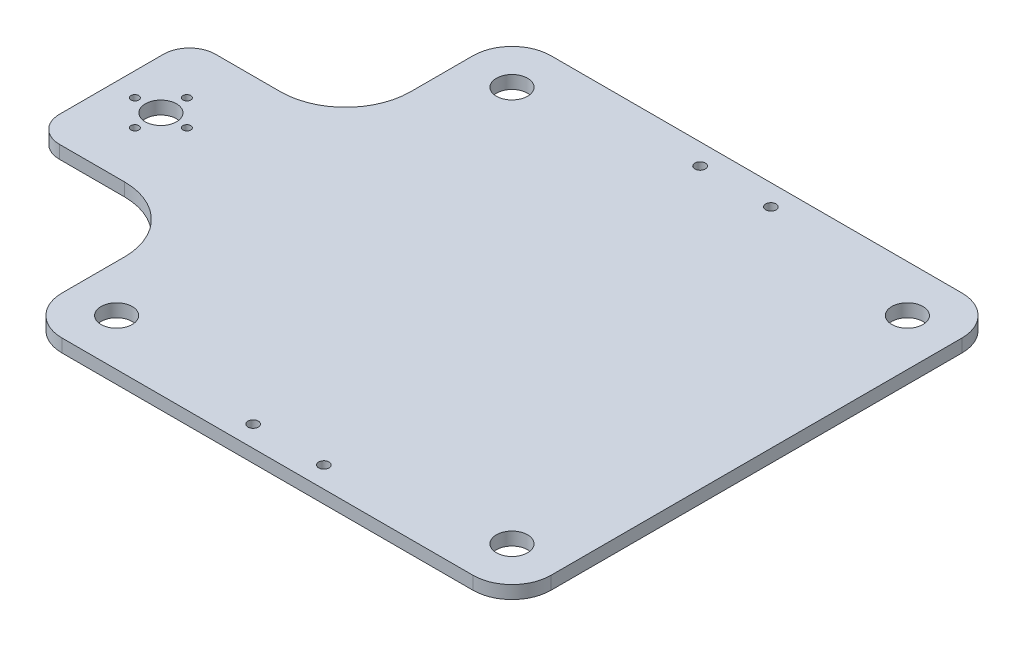
ISO-10303-21;
HEADER;
FILE_DESCRIPTION(('STEP AP214'),'2;1');
FILE_NAME('part.step','',(''),(''),'','','');
FILE_SCHEMA(('AUTOMOTIVE_DESIGN { 1 0 10303 214 1 1 1 1 }'));
ENDSEC;
DATA;
#1=APPLICATION_CONTEXT('core data for automotive mechanical design processes');
#2=APPLICATION_PROTOCOL_DEFINITION('international standard','automotive_design',2000,#1);
#3=PRODUCT_CONTEXT('',#1,'mechanical');
#4=PRODUCT('Part','Part','',(#3));
#5=PRODUCT_RELATED_PRODUCT_CATEGORY('part','',(#4));
#6=PRODUCT_DEFINITION_FORMATION('','',#4);
#7=PRODUCT_DEFINITION_CONTEXT('part definition',#1,'design');
#8=PRODUCT_DEFINITION('design','',#6,#7);
#9=PRODUCT_DEFINITION_SHAPE('','',#8);
#10=(LENGTH_UNIT() NAMED_UNIT(*) SI_UNIT(.MILLI.,.METRE.));
#11=(NAMED_UNIT(*) PLANE_ANGLE_UNIT() SI_UNIT($,.RADIAN.));
#12=(NAMED_UNIT(*) SI_UNIT($,.STERADIAN.) SOLID_ANGLE_UNIT());
#13=UNCERTAINTY_MEASURE_WITH_UNIT(LENGTH_MEASURE(1.E-05),#10,'distance_accuracy_value','');
#14=(GEOMETRIC_REPRESENTATION_CONTEXT(3) GLOBAL_UNCERTAINTY_ASSIGNED_CONTEXT((#13)) GLOBAL_UNIT_ASSIGNED_CONTEXT((#10,
#11,#12)) REPRESENTATION_CONTEXT('',''));
#15=CARTESIAN_POINT('',(0.,0.,0.));
#16=DIRECTION('',(0.,0.,1.));
#17=DIRECTION('',(1.,0.,0.));
#18=AXIS2_PLACEMENT_3D('',#15,#16,#17);
#19=CARTESIAN_POINT('',(-79.,2.5,79.));
#20=DIRECTION('',(0.,-1.,0.));
#21=DIRECTION('',(0.,0.,-1.));
#22=AXIS2_PLACEMENT_3D('',#19,#20,#21);
#23=PLANE('',#22);
#24=DIRECTION('',(0.,0.,1.));
#25=VECTOR('',#24,1.);
#26=CARTESIAN_POINT('',(-154.,2.5,30.));
#27=LINE('',#26,#25);
#28=CARTESIAN_POINT('',(-154.,2.5,-20.));
#29=VERTEX_POINT('',#28);
#30=CARTESIAN_POINT('',(-154.,2.5,20.));
#31=VERTEX_POINT('',#30);
#32=EDGE_CURVE('E212',#29,#31,#27,.T.);
#33=ORIENTED_EDGE('',*,*,#32,.T.);
#34=CARTESIAN_POINT('',(-144.,2.5,20.));
#35=DIRECTION('',(0.,-1.,0.));
#36=DIRECTION('',(0.,0.,-1.));
#37=AXIS2_PLACEMENT_3D('',#34,#35,#36);
#38=CIRCLE('',#37,10.);
#39=CARTESIAN_POINT('',(-144.,2.5,30.));
#40=VERTEX_POINT('',#39);
#41=EDGE_CURVE('E42',#31,#40,#38,.F.);
#42=ORIENTED_EDGE('',*,*,#41,.T.);
#43=DIRECTION('',(1.,0.,0.));
#44=VECTOR('',#43,1.);
#45=CARTESIAN_POINT('',(-94.,2.5,30.));
#46=LINE('',#45,#44);
#47=CARTESIAN_POINT('',(-119.,2.5,30.));
#48=VERTEX_POINT('',#47);
#49=EDGE_CURVE('E211',#40,#48,#46,.T.);
#50=ORIENTED_EDGE('',*,*,#49,.T.);
#51=CARTESIAN_POINT('',(-119.,2.5,55.));
#52=DIRECTION('',(0.,-1.,0.));
#53=DIRECTION('',(0.,0.,-1.));
#54=AXIS2_PLACEMENT_3D('',#51,#52,#53);
#55=CIRCLE('',#54,25.);
#56=CARTESIAN_POINT('',(-94.,2.5,55.));
#57=VERTEX_POINT('',#56);
#58=EDGE_CURVE('E154',#48,#57,#55,.T.);
#59=ORIENTED_EDGE('',*,*,#58,.T.);
#60=DIRECTION('',(0.,0.,1.));
#61=VECTOR('',#60,1.);
#62=CARTESIAN_POINT('',(-94.,2.5,30.));
#63=LINE('',#62,#61);
#64=CARTESIAN_POINT('',(-94.,2.5,79.));
#65=VERTEX_POINT('',#64);
#66=EDGE_CURVE('E148',#57,#65,#63,.T.);
#67=ORIENTED_EDGE('',*,*,#66,.T.);
#68=CARTESIAN_POINT('',(-79.,2.5,79.));
#69=DIRECTION('',(0.,1.,0.));
#70=DIRECTION('',(0.,0.,-1.));
#71=AXIS2_PLACEMENT_3D('',#68,#69,#70);
#72=CIRCLE('',#71,15.);
#73=CARTESIAN_POINT('',(-79.,2.5,94.));
#74=VERTEX_POINT('',#73);
#75=EDGE_CURVE('E151',#65,#74,#72,.T.);
#76=ORIENTED_EDGE('',*,*,#75,.T.);
#77=DIRECTION('',(1.,0.,0.));
#78=VECTOR('',#77,1.);
#79=CARTESIAN_POINT('',(-79.,2.5,94.));
#80=LINE('',#79,#78);
#81=CARTESIAN_POINT('',(79.,2.5,94.));
#82=VERTEX_POINT('',#81);
#83=EDGE_CURVE('E168',#74,#82,#80,.T.);
#84=ORIENTED_EDGE('',*,*,#83,.T.);
#85=CARTESIAN_POINT('',(79.,2.5,79.));
#86=DIRECTION('',(0.,1.,0.));
#87=DIRECTION('',(0.,0.,-1.));
#88=AXIS2_PLACEMENT_3D('',#85,#86,#87);
#89=CIRCLE('',#88,15.);
#90=CARTESIAN_POINT('',(94.,2.5,79.));
#91=VERTEX_POINT('',#90);
#92=EDGE_CURVE('E257',#82,#91,#89,.T.);
#93=ORIENTED_EDGE('',*,*,#92,.T.);
#94=DIRECTION('',(0.,0.,-1.));
#95=VECTOR('',#94,1.);
#96=CARTESIAN_POINT('',(94.,2.5,-79.));
#97=LINE('',#96,#95);
#98=CARTESIAN_POINT('',(94.,2.5,-79.));
#99=VERTEX_POINT('',#98);
#100=EDGE_CURVE('E302',#91,#99,#97,.T.);
#101=ORIENTED_EDGE('',*,*,#100,.T.);
#102=CARTESIAN_POINT('',(79.,2.5,-79.));
#103=DIRECTION('',(0.,1.,0.));
#104=DIRECTION('',(0.,0.,1.));
#105=AXIS2_PLACEMENT_3D('',#102,#103,#104);
#106=CIRCLE('',#105,15.);
#107=CARTESIAN_POINT('',(79.,2.5,-94.));
#108=VERTEX_POINT('',#107);
#109=EDGE_CURVE('E306',#99,#108,#106,.T.);
#110=ORIENTED_EDGE('',*,*,#109,.T.);
#111=DIRECTION('',(-1.,0.,0.));
#112=VECTOR('',#111,1.);
#113=CARTESIAN_POINT('',(-79.,2.5,-94.));
#114=LINE('',#113,#112);
#115=CARTESIAN_POINT('',(-79.,2.5,-94.));
#116=VERTEX_POINT('',#115);
#117=EDGE_CURVE('E308',#108,#116,#114,.T.);
#118=ORIENTED_EDGE('',*,*,#117,.T.);
#119=CARTESIAN_POINT('',(-79.,2.5,-79.));
#120=DIRECTION('',(0.,1.,0.));
#121=DIRECTION('',(0.,0.,-1.));
#122=AXIS2_PLACEMENT_3D('',#119,#120,#121);
#123=CIRCLE('',#122,15.);
#124=CARTESIAN_POINT('',(-94.,2.5,-79.));
#125=VERTEX_POINT('',#124);
#126=EDGE_CURVE('E295',#116,#125,#123,.T.);
#127=ORIENTED_EDGE('',*,*,#126,.T.);
#128=DIRECTION('',(0.,0.,1.));
#129=VECTOR('',#128,1.);
#130=CARTESIAN_POINT('',(-94.,2.5,-79.));
#131=LINE('',#130,#129);
#132=CARTESIAN_POINT('',(-94.,2.5,-55.));
#133=VERTEX_POINT('',#132);
#134=EDGE_CURVE('E290',#125,#133,#131,.T.);
#135=ORIENTED_EDGE('',*,*,#134,.T.);
#136=CARTESIAN_POINT('',(-119.,2.5,-55.));
#137=DIRECTION('',(0.,-1.,0.));
#138=DIRECTION('',(0.,0.,-1.));
#139=AXIS2_PLACEMENT_3D('',#136,#137,#138);
#140=CIRCLE('',#139,25.);
#141=CARTESIAN_POINT('',(-119.,2.5,-30.));
#142=VERTEX_POINT('',#141);
#143=EDGE_CURVE('E195',#133,#142,#140,.T.);
#144=ORIENTED_EDGE('',*,*,#143,.T.);
#145=DIRECTION('',(-1.,0.,0.));
#146=VECTOR('',#145,1.);
#147=CARTESIAN_POINT('',(-154.,2.5,-30.));
#148=LINE('',#147,#146);
#149=CARTESIAN_POINT('',(-144.,2.5,-30.));
#150=VERTEX_POINT('',#149);
#151=EDGE_CURVE('E288',#142,#150,#148,.T.);
#152=ORIENTED_EDGE('',*,*,#151,.T.);
#153=CARTESIAN_POINT('',(-144.,2.5,-20.));
#154=DIRECTION('',(0.,-1.,0.));
#155=DIRECTION('',(0.,0.,-1.));
#156=AXIS2_PLACEMENT_3D('',#153,#154,#155);
#157=CIRCLE('',#156,10.);
#158=EDGE_CURVE('E208',#150,#29,#157,.F.);
#159=ORIENTED_EDGE('',*,*,#158,.T.);
#160=EDGE_LOOP('',(#33,#42,#50,#59,#67,#76,#84,#93,#101,#110,#118,#127,#135,#144,#152,#159));
#161=FACE_BOUND('',#160,.T.);
#162=CARTESIAN_POINT('',(-76.0139789775538,2.5,-76.0139789775538));
#163=DIRECTION('',(0.,1.,0.));
#164=DIRECTION('',(0.,0.,1.));
#165=AXIS2_PLACEMENT_3D('',#162,#163,#164);
#166=CIRCLE('',#165,6.);
#167=CARTESIAN_POINT('',(-76.0139789775538,2.5,-70.0139789775538));
#168=VERTEX_POINT('',#167);
#169=EDGE_CURVE('E299',#168,#168,#166,.T.);
#170=ORIENTED_EDGE('',*,*,#169,.F.);
#171=EDGE_LOOP('',(#170));
#172=FACE_BOUND('',#171,.T.);
#173=CARTESIAN_POINT('',(76.0139789775538,2.5,-76.0139789775538));
#174=DIRECTION('',(0.,1.,0.));
#175=DIRECTION('',(0.,0.,1.));
#176=AXIS2_PLACEMENT_3D('',#173,#174,#175);
#177=CIRCLE('',#176,5.99999999999999);
#178=CARTESIAN_POINT('',(76.0139789775538,2.5,-70.0139789775538));
#179=VERTEX_POINT('',#178);
#180=EDGE_CURVE('E673',#179,#179,#177,.T.);
#181=ORIENTED_EDGE('',*,*,#180,.F.);
#182=EDGE_LOOP('',(#181));
#183=FACE_BOUND('',#182,.T.);
#184=CARTESIAN_POINT('',(76.0139789775538,2.5,76.0139789775538));
#185=DIRECTION('',(0.,1.,0.));
#186=DIRECTION('',(0.,0.,1.));
#187=AXIS2_PLACEMENT_3D('',#184,#185,#186);
#188=CIRCLE('',#187,5.99999999999999);
#189=CARTESIAN_POINT('',(76.0139789775538,2.5,82.0139789775538));
#190=VERTEX_POINT('',#189);
#191=EDGE_CURVE('E667',#190,#190,#188,.T.);
#192=ORIENTED_EDGE('',*,*,#191,.F.);
#193=EDGE_LOOP('',(#192));
#194=FACE_BOUND('',#193,.T.);
#195=CARTESIAN_POINT('',(-76.0139789775538,2.5,76.0139789775538));
#196=DIRECTION('',(0.,1.,0.));
#197=DIRECTION('',(0.,0.,1.));
#198=AXIS2_PLACEMENT_3D('',#195,#196,#197);
#199=CIRCLE('',#198,5.99999999999999);
#200=CARTESIAN_POINT('',(-76.0139789775538,2.5,82.0139789775538));
#201=VERTEX_POINT('',#200);
#202=EDGE_CURVE('E661',#201,#201,#199,.T.);
#203=ORIENTED_EDGE('',*,*,#202,.F.);
#204=EDGE_LOOP('',(#203));
#205=FACE_BOUND('',#204,.T.);
#206=CARTESIAN_POINT('',(13.6097984585001,2.5,-85.928885631777));
#207=DIRECTION('',(0.,1.,0.));
#208=DIRECTION('',(0.,0.,1.));
#209=AXIS2_PLACEMENT_3D('',#206,#207,#208);
#210=CIRCLE('',#209,2.);
#211=CARTESIAN_POINT('',(13.6097984585001,2.5,-83.928885631777));
#212=VERTEX_POINT('',#211);
#213=EDGE_CURVE('E655',#212,#212,#210,.T.);
#214=ORIENTED_EDGE('',*,*,#213,.F.);
#215=EDGE_LOOP('',(#214));
#216=FACE_BOUND('',#215,.T.);
#217=CARTESIAN_POINT('',(13.6097984584996,2.5,85.9288856317771));
#218=DIRECTION('',(0.,1.,0.));
#219=DIRECTION('',(0.,0.,1.));
#220=AXIS2_PLACEMENT_3D('',#217,#218,#219);
#221=CIRCLE('',#220,2.);
#222=CARTESIAN_POINT('',(13.6097984584996,2.5,87.9288856317771));
#223=VERTEX_POINT('',#222);
#224=EDGE_CURVE('E649',#223,#223,#221,.T.);
#225=ORIENTED_EDGE('',*,*,#224,.F.);
#226=EDGE_LOOP('',(#225));
#227=FACE_BOUND('',#226,.T.);
#228=CARTESIAN_POINT('',(-13.6097984584995,2.5,-85.9288856317771));
#229=DIRECTION('',(0.,1.,0.));
#230=DIRECTION('',(0.,0.,1.));
#231=AXIS2_PLACEMENT_3D('',#228,#229,#230);
#232=CIRCLE('',#231,2.);
#233=CARTESIAN_POINT('',(-13.6097984584995,2.5,-83.9288856317771));
#234=VERTEX_POINT('',#233);
#235=EDGE_CURVE('E643',#234,#234,#232,.T.);
#236=ORIENTED_EDGE('',*,*,#235,.F.);
#237=EDGE_LOOP('',(#236));
#238=FACE_BOUND('',#237,.T.);
#239=CARTESIAN_POINT('',(-135.,2.5,10.));
#240=DIRECTION('',(0.,1.,0.));
#241=DIRECTION('',(0.,0.,1.));
#242=AXIS2_PLACEMENT_3D('',#239,#240,#241);
#243=CIRCLE('',#242,1.5);
#244=CARTESIAN_POINT('',(-135.,2.5,11.5));
#245=VERTEX_POINT('',#244);
#246=EDGE_CURVE('E637',#245,#245,#243,.T.);
#247=ORIENTED_EDGE('',*,*,#246,.F.);
#248=EDGE_LOOP('',(#247));
#249=FACE_BOUND('',#248,.T.);
#250=CARTESIAN_POINT('',(-135.,2.5,0.));
#251=DIRECTION('',(0.,1.,0.));
#252=DIRECTION('',(0.,0.,1.));
#253=AXIS2_PLACEMENT_3D('',#250,#251,#252);
#254=CIRCLE('',#253,6.00000000000002);
#255=CARTESIAN_POINT('',(-135.,2.5,6.00000000000002));
#256=VERTEX_POINT('',#255);
#257=EDGE_CURVE('E631',#256,#256,#254,.T.);
#258=ORIENTED_EDGE('',*,*,#257,.F.);
#259=EDGE_LOOP('',(#258));
#260=FACE_BOUND('',#259,.T.);
#261=CARTESIAN_POINT('',(-145.,2.5,0.));
#262=DIRECTION('',(0.,1.,0.));
#263=DIRECTION('',(0.,0.,1.));
#264=AXIS2_PLACEMENT_3D('',#261,#262,#263);
#265=CIRCLE('',#264,1.5);
#266=CARTESIAN_POINT('',(-145.,2.5,1.49999999999999));
#267=VERTEX_POINT('',#266);
#268=EDGE_CURVE('E625',#267,#267,#265,.T.);
#269=ORIENTED_EDGE('',*,*,#268,.F.);
#270=EDGE_LOOP('',(#269));
#271=FACE_BOUND('',#270,.T.);
#272=CARTESIAN_POINT('',(-13.6097984585001,2.5,85.928885631777));
#273=DIRECTION('',(0.,1.,0.));
#274=DIRECTION('',(0.,0.,1.));
#275=AXIS2_PLACEMENT_3D('',#272,#273,#274);
#276=CIRCLE('',#275,2.);
#277=CARTESIAN_POINT('',(-13.6097984585001,2.5,87.928885631777));
#278=VERTEX_POINT('',#277);
#279=EDGE_CURVE('E619',#278,#278,#276,.T.);
#280=ORIENTED_EDGE('',*,*,#279,.F.);
#281=EDGE_LOOP('',(#280));
#282=FACE_BOUND('',#281,.T.);
#283=CARTESIAN_POINT('',(-135.,2.5,-10.));
#284=DIRECTION('',(0.,1.,0.));
#285=DIRECTION('',(0.,0.,1.));
#286=AXIS2_PLACEMENT_3D('',#283,#284,#285);
#287=CIRCLE('',#286,1.5);
#288=CARTESIAN_POINT('',(-135.,2.5,-8.50000000000001));
#289=VERTEX_POINT('',#288);
#290=EDGE_CURVE('E613',#289,#289,#287,.T.);
#291=ORIENTED_EDGE('',*,*,#290,.F.);
#292=EDGE_LOOP('',(#291));
#293=FACE_BOUND('',#292,.T.);
#294=CARTESIAN_POINT('',(-125.,2.5,0.));
#295=DIRECTION('',(0.,1.,0.));
#296=DIRECTION('',(0.,0.,1.));
#297=AXIS2_PLACEMENT_3D('',#294,#295,#296);
#298=CIRCLE('',#297,1.5);
#299=CARTESIAN_POINT('',(-125.,2.5,1.5));
#300=VERTEX_POINT('',#299);
#301=EDGE_CURVE('E604',#300,#300,#298,.T.);
#302=ORIENTED_EDGE('',*,*,#301,.F.);
#303=EDGE_LOOP('',(#302));
#304=FACE_BOUND('',#303,.T.);
#305=ADVANCED_FACE('F34',(#161,#172,#183,#194,#205,#216,#227,#238,#249,#260,#271,#282,#293,
#304),#23,.F.);
#306=CARTESIAN_POINT('',(-79.,-2.5,79.));
#307=DIRECTION('',(0.,-1.,0.));
#308=DIRECTION('',(0.,0.,-1.));
#309=AXIS2_PLACEMENT_3D('',#306,#307,#308);
#310=PLANE('',#309);
#311=CARTESIAN_POINT('',(-135.,-2.5,-10.));
#312=DIRECTION('',(0.,1.,0.));
#313=DIRECTION('',(0.,0.,1.));
#314=AXIS2_PLACEMENT_3D('',#311,#312,#313);
#315=CIRCLE('',#314,1.5);
#316=CARTESIAN_POINT('',(-135.,-2.5,-8.50000000000001));
#317=VERTEX_POINT('',#316);
#318=EDGE_CURVE('E610',#317,#317,#315,.T.);
#319=ORIENTED_EDGE('',*,*,#318,.T.);
#320=EDGE_LOOP('',(#319));
#321=FACE_BOUND('',#320,.T.);
#322=CARTESIAN_POINT('',(-145.,-2.5,0.));
#323=DIRECTION('',(0.,1.,0.));
#324=DIRECTION('',(0.,0.,1.));
#325=AXIS2_PLACEMENT_3D('',#322,#323,#324);
#326=CIRCLE('',#325,1.5);
#327=CARTESIAN_POINT('',(-145.,-2.5,1.49999999999999));
#328=VERTEX_POINT('',#327);
#329=EDGE_CURVE('E622',#328,#328,#326,.T.);
#330=ORIENTED_EDGE('',*,*,#329,.T.);
#331=EDGE_LOOP('',(#330));
#332=FACE_BOUND('',#331,.T.);
#333=CARTESIAN_POINT('',(-135.,-2.5,10.));
#334=DIRECTION('',(0.,1.,0.));
#335=DIRECTION('',(0.,0.,1.));
#336=AXIS2_PLACEMENT_3D('',#333,#334,#335);
#337=CIRCLE('',#336,1.5);
#338=CARTESIAN_POINT('',(-135.,-2.5,11.5));
#339=VERTEX_POINT('',#338);
#340=EDGE_CURVE('E634',#339,#339,#337,.T.);
#341=ORIENTED_EDGE('',*,*,#340,.T.);
#342=EDGE_LOOP('',(#341));
#343=FACE_BOUND('',#342,.T.);
#344=CARTESIAN_POINT('',(13.6097984584996,-2.5,85.9288856317771));
#345=DIRECTION('',(0.,1.,0.));
#346=DIRECTION('',(0.,0.,1.));
#347=AXIS2_PLACEMENT_3D('',#344,#345,#346);
#348=CIRCLE('',#347,2.);
#349=CARTESIAN_POINT('',(13.6097984584996,-2.5,87.9288856317771));
#350=VERTEX_POINT('',#349);
#351=EDGE_CURVE('E646',#350,#350,#348,.T.);
#352=ORIENTED_EDGE('',*,*,#351,.T.);
#353=EDGE_LOOP('',(#352));
#354=FACE_BOUND('',#353,.T.);
#355=CARTESIAN_POINT('',(-76.0139789775538,-2.5,76.0139789775538));
#356=DIRECTION('',(0.,1.,0.));
#357=DIRECTION('',(0.,0.,1.));
#358=AXIS2_PLACEMENT_3D('',#355,#356,#357);
#359=CIRCLE('',#358,5.99999999999999);
#360=CARTESIAN_POINT('',(-76.0139789775538,-2.5,82.0139789775538));
#361=VERTEX_POINT('',#360);
#362=EDGE_CURVE('E658',#361,#361,#359,.T.);
#363=ORIENTED_EDGE('',*,*,#362,.T.);
#364=EDGE_LOOP('',(#363));
#365=FACE_BOUND('',#364,.T.);
#366=CARTESIAN_POINT('',(76.0139789775538,-2.5,-76.0139789775538));
#367=DIRECTION('',(0.,1.,0.));
#368=DIRECTION('',(0.,0.,1.));
#369=AXIS2_PLACEMENT_3D('',#366,#367,#368);
#370=CIRCLE('',#369,5.99999999999999);
#371=CARTESIAN_POINT('',(76.0139789775538,-2.5,-70.0139789775538));
#372=VERTEX_POINT('',#371);
#373=EDGE_CURVE('E670',#372,#372,#370,.T.);
#374=ORIENTED_EDGE('',*,*,#373,.T.);
#375=EDGE_LOOP('',(#374));
#376=FACE_BOUND('',#375,.T.);
#377=DIRECTION('',(1.,0.,0.));
#378=VECTOR('',#377,1.);
#379=CARTESIAN_POINT('',(-94.,-2.5,30.));
#380=LINE('',#379,#378);
#381=CARTESIAN_POINT('',(-144.,-2.5,30.));
#382=VERTEX_POINT('',#381);
#383=CARTESIAN_POINT('',(-119.,-2.5,30.));
#384=VERTEX_POINT('',#383);
#385=EDGE_CURVE('E159',#382,#384,#380,.T.);
#386=ORIENTED_EDGE('',*,*,#385,.F.);
#387=CARTESIAN_POINT('',(-144.,-2.5,20.));
#388=DIRECTION('',(0.,-1.,0.));
#389=DIRECTION('',(0.,0.,-1.));
#390=AXIS2_PLACEMENT_3D('',#387,#388,#389);
#391=CIRCLE('',#390,10.);
#392=CARTESIAN_POINT('',(-154.,-2.5,20.));
#393=VERTEX_POINT('',#392);
#394=EDGE_CURVE('E202',#382,#393,#391,.T.);
#395=ORIENTED_EDGE('',*,*,#394,.T.);
#396=DIRECTION('',(0.,0.,1.));
#397=VECTOR('',#396,1.);
#398=CARTESIAN_POINT('',(-154.,-2.5,30.));
#399=LINE('',#398,#397);
#400=CARTESIAN_POINT('',(-154.,-2.5,-20.));
#401=VERTEX_POINT('',#400);
#402=EDGE_CURVE('E226',#401,#393,#399,.T.);
#403=ORIENTED_EDGE('',*,*,#402,.F.);
#404=CARTESIAN_POINT('',(-144.,-2.5,-20.));
#405=DIRECTION('',(0.,-1.,0.));
#406=DIRECTION('',(0.,0.,-1.));
#407=AXIS2_PLACEMENT_3D('',#404,#405,#406);
#408=CIRCLE('',#407,10.);
#409=CARTESIAN_POINT('',(-144.,-2.5,-30.));
#410=VERTEX_POINT('',#409);
#411=EDGE_CURVE('E200',#401,#410,#408,.T.);
#412=ORIENTED_EDGE('',*,*,#411,.T.);
#413=DIRECTION('',(-1.,0.,0.));
#414=VECTOR('',#413,1.);
#415=CARTESIAN_POINT('',(-154.,-2.5,-30.));
#416=LINE('',#415,#414);
#417=CARTESIAN_POINT('',(-119.,-2.5,-30.));
#418=VERTEX_POINT('',#417);
#419=EDGE_CURVE('E229',#418,#410,#416,.T.);
#420=ORIENTED_EDGE('',*,*,#419,.F.);
#421=CARTESIAN_POINT('',(-119.,-2.5,-55.));
#422=DIRECTION('',(0.,-1.,0.));
#423=DIRECTION('',(0.,0.,-1.));
#424=AXIS2_PLACEMENT_3D('',#421,#422,#423);
#425=CIRCLE('',#424,25.);
#426=CARTESIAN_POINT('',(-94.,-2.5,-55.));
#427=VERTEX_POINT('',#426);
#428=EDGE_CURVE('E193',#418,#427,#425,.F.);
#429=ORIENTED_EDGE('',*,*,#428,.T.);
#430=DIRECTION('',(0.,0.,1.));
#431=VECTOR('',#430,1.);
#432=CARTESIAN_POINT('',(-94.,-2.5,-79.));
#433=LINE('',#432,#431);
#434=CARTESIAN_POINT('',(-94.,-2.5,-79.));
#435=VERTEX_POINT('',#434);
#436=EDGE_CURVE('E232',#435,#427,#433,.T.);
#437=ORIENTED_EDGE('',*,*,#436,.F.);
#438=CARTESIAN_POINT('',(-79.,-2.5,-79.));
#439=DIRECTION('',(0.,1.,0.));
#440=DIRECTION('',(0.,0.,-1.));
#441=AXIS2_PLACEMENT_3D('',#438,#439,#440);
#442=CIRCLE('',#441,15.);
#443=CARTESIAN_POINT('',(-79.,-2.5,-94.));
#444=VERTEX_POINT('',#443);
#445=EDGE_CURVE('E274',#444,#435,#442,.T.);
#446=ORIENTED_EDGE('',*,*,#445,.F.);
#447=DIRECTION('',(-1.,0.,0.));
#448=VECTOR('',#447,1.);
#449=CARTESIAN_POINT('',(-79.,-2.5,-94.));
#450=LINE('',#449,#448);
#451=CARTESIAN_POINT('',(79.,-2.5,-94.));
#452=VERTEX_POINT('',#451);
#453=EDGE_CURVE('E272',#452,#444,#450,.T.);
#454=ORIENTED_EDGE('',*,*,#453,.F.);
#455=CARTESIAN_POINT('',(79.,-2.5,-79.));
#456=DIRECTION('',(0.,1.,0.));
#457=DIRECTION('',(0.,0.,1.));
#458=AXIS2_PLACEMENT_3D('',#455,#456,#457);
#459=CIRCLE('',#458,15.);
#460=CARTESIAN_POINT('',(94.,-2.5,-79.));
#461=VERTEX_POINT('',#460);
#462=EDGE_CURVE('E265',#461,#452,#459,.T.);
#463=ORIENTED_EDGE('',*,*,#462,.F.);
#464=DIRECTION('',(0.,0.,-1.));
#465=VECTOR('',#464,1.);
#466=CARTESIAN_POINT('',(94.,-2.5,-79.));
#467=LINE('',#466,#465);
#468=CARTESIAN_POINT('',(94.,-2.5,79.));
#469=VERTEX_POINT('',#468);
#470=EDGE_CURVE('E263',#469,#461,#467,.T.);
#471=ORIENTED_EDGE('',*,*,#470,.F.);
#472=CARTESIAN_POINT('',(79.,-2.5,79.));
#473=DIRECTION('',(0.,1.,0.));
#474=DIRECTION('',(0.,0.,-1.));
#475=AXIS2_PLACEMENT_3D('',#472,#473,#474);
#476=CIRCLE('',#475,15.);
#477=CARTESIAN_POINT('',(79.,-2.5,94.));
#478=VERTEX_POINT('',#477);
#479=EDGE_CURVE('E256',#478,#469,#476,.T.);
#480=ORIENTED_EDGE('',*,*,#479,.F.);
#481=DIRECTION('',(1.,0.,0.));
#482=VECTOR('',#481,1.);
#483=CARTESIAN_POINT('',(-79.,-2.5,94.));
#484=LINE('',#483,#482);
#485=CARTESIAN_POINT('',(-79.,-2.5,94.));
#486=VERTEX_POINT('',#485);
#487=EDGE_CURVE('E261',#486,#478,#484,.T.);
#488=ORIENTED_EDGE('',*,*,#487,.F.);
#489=CARTESIAN_POINT('',(-79.,-2.5,79.));
#490=DIRECTION('',(0.,1.,0.));
#491=DIRECTION('',(0.,0.,-1.));
#492=AXIS2_PLACEMENT_3D('',#489,#490,#491);
#493=CIRCLE('',#492,15.);
#494=CARTESIAN_POINT('',(-94.,-2.5,79.));
#495=VERTEX_POINT('',#494);
#496=EDGE_CURVE('E267',#495,#486,#493,.T.);
#497=ORIENTED_EDGE('',*,*,#496,.F.);
#498=DIRECTION('',(0.,0.,1.));
#499=VECTOR('',#498,1.);
#500=CARTESIAN_POINT('',(-94.,-2.5,30.));
#501=LINE('',#500,#499);
#502=CARTESIAN_POINT('',(-94.,-2.5,55.));
#503=VERTEX_POINT('',#502);
#504=EDGE_CURVE('E172',#503,#495,#501,.T.);
#505=ORIENTED_EDGE('',*,*,#504,.F.);
#506=CARTESIAN_POINT('',(-119.,-2.5,55.));
#507=DIRECTION('',(0.,-1.,0.));
#508=DIRECTION('',(0.,0.,-1.));
#509=AXIS2_PLACEMENT_3D('',#506,#507,#508);
#510=CIRCLE('',#509,25.);
#511=EDGE_CURVE('E189',#503,#384,#510,.F.);
#512=ORIENTED_EDGE('',*,*,#511,.T.);
#513=EDGE_LOOP('',(#386,#395,#403,#412,#420,#429,#437,#446,#454,#463,#471,#480,#488,#497,#505,#512));
#514=FACE_BOUND('',#513,.T.);
#515=CARTESIAN_POINT('',(-76.0139789775538,-2.5,-76.0139789775538));
#516=DIRECTION('',(0.,1.,0.));
#517=DIRECTION('',(0.,0.,1.));
#518=AXIS2_PLACEMENT_3D('',#515,#516,#517);
#519=CIRCLE('',#518,6.);
#520=CARTESIAN_POINT('',(-76.0139789775538,-2.5,-70.0139789775538));
#521=VERTEX_POINT('',#520);
#522=EDGE_CURVE('E676',#521,#521,#519,.T.);
#523=ORIENTED_EDGE('',*,*,#522,.T.);
#524=EDGE_LOOP('',(#523));
#525=FACE_BOUND('',#524,.T.);
#526=CARTESIAN_POINT('',(76.0139789775538,-2.5,76.0139789775538));
#527=DIRECTION('',(0.,1.,0.));
#528=DIRECTION('',(0.,0.,1.));
#529=AXIS2_PLACEMENT_3D('',#526,#527,#528);
#530=CIRCLE('',#529,5.99999999999999);
#531=CARTESIAN_POINT('',(76.0139789775538,-2.5,82.0139789775538));
#532=VERTEX_POINT('',#531);
#533=EDGE_CURVE('E664',#532,#532,#530,.T.);
#534=ORIENTED_EDGE('',*,*,#533,.T.);
#535=EDGE_LOOP('',(#534));
#536=FACE_BOUND('',#535,.T.);
#537=CARTESIAN_POINT('',(13.6097984585001,-2.5,-85.928885631777));
#538=DIRECTION('',(0.,1.,0.));
#539=DIRECTION('',(0.,0.,1.));
#540=AXIS2_PLACEMENT_3D('',#537,#538,#539);
#541=CIRCLE('',#540,2.);
#542=CARTESIAN_POINT('',(13.6097984585001,-2.5,-83.928885631777));
#543=VERTEX_POINT('',#542);
#544=EDGE_CURVE('E652',#543,#543,#541,.T.);
#545=ORIENTED_EDGE('',*,*,#544,.T.);
#546=EDGE_LOOP('',(#545));
#547=FACE_BOUND('',#546,.T.);
#548=CARTESIAN_POINT('',(-13.6097984584995,-2.5,-85.9288856317771));
#549=DIRECTION('',(0.,1.,0.));
#550=DIRECTION('',(0.,0.,1.));
#551=AXIS2_PLACEMENT_3D('',#548,#549,#550);
#552=CIRCLE('',#551,2.);
#553=CARTESIAN_POINT('',(-13.6097984584995,-2.5,-83.9288856317771));
#554=VERTEX_POINT('',#553);
#555=EDGE_CURVE('E640',#554,#554,#552,.T.);
#556=ORIENTED_EDGE('',*,*,#555,.T.);
#557=EDGE_LOOP('',(#556));
#558=FACE_BOUND('',#557,.T.);
#559=CARTESIAN_POINT('',(-135.,-2.5,0.));
#560=DIRECTION('',(0.,1.,0.));
#561=DIRECTION('',(0.,0.,1.));
#562=AXIS2_PLACEMENT_3D('',#559,#560,#561);
#563=CIRCLE('',#562,6.00000000000002);
#564=CARTESIAN_POINT('',(-135.,-2.5,6.00000000000002));
#565=VERTEX_POINT('',#564);
#566=EDGE_CURVE('E628',#565,#565,#563,.T.);
#567=ORIENTED_EDGE('',*,*,#566,.T.);
#568=EDGE_LOOP('',(#567));
#569=FACE_BOUND('',#568,.T.);
#570=CARTESIAN_POINT('',(-13.6097984585001,-2.5,85.928885631777));
#571=DIRECTION('',(0.,1.,0.));
#572=DIRECTION('',(0.,0.,1.));
#573=AXIS2_PLACEMENT_3D('',#570,#571,#572);
#574=CIRCLE('',#573,2.);
#575=CARTESIAN_POINT('',(-13.6097984585001,-2.5,87.928885631777));
#576=VERTEX_POINT('',#575);
#577=EDGE_CURVE('E616',#576,#576,#574,.T.);
#578=ORIENTED_EDGE('',*,*,#577,.T.);
#579=EDGE_LOOP('',(#578));
#580=FACE_BOUND('',#579,.T.);
#581=CARTESIAN_POINT('',(-125.,-2.5,0.));
#582=DIRECTION('',(0.,1.,0.));
#583=DIRECTION('',(0.,0.,1.));
#584=AXIS2_PLACEMENT_3D('',#581,#582,#583);
#585=CIRCLE('',#584,1.5);
#586=CARTESIAN_POINT('',(-125.,-2.5,1.5));
#587=VERTEX_POINT('',#586);
#588=EDGE_CURVE('E607',#587,#587,#585,.T.);
#589=ORIENTED_EDGE('',*,*,#588,.T.);
#590=EDGE_LOOP('',(#589));
#591=FACE_BOUND('',#590,.T.);
#592=ADVANCED_FACE('F224',(#321,#332,#343,#354,#365,#376,#514,#525,#536,#547,#558,#569,#580,
#591),#310,.T.);
#593=CARTESIAN_POINT('',(-94.,2.5,30.));
#594=DIRECTION('',(1.,0.,0.));
#595=DIRECTION('',(0.,0.,-1.));
#596=AXIS2_PLACEMENT_3D('',#593,#594,#595);
#597=PLANE('',#596);
#598=ORIENTED_EDGE('',*,*,#66,.F.);
#599=DIRECTION('',(0.,-1.,0.));
#600=VECTOR('',#599,1.);
#601=CARTESIAN_POINT('',(-94.,-2.5,55.));
#602=LINE('',#601,#600);
#603=EDGE_CURVE('E174',#57,#503,#602,.T.);
#604=ORIENTED_EDGE('',*,*,#603,.T.);
#605=ORIENTED_EDGE('',*,*,#504,.T.);
#606=DIRECTION('',(0.,-1.,0.));
#607=VECTOR('',#606,1.);
#608=CARTESIAN_POINT('',(-94.,2.5,79.));
#609=LINE('',#608,#607);
#610=EDGE_CURVE('E164',#65,#495,#609,.T.);
#611=ORIENTED_EDGE('',*,*,#610,.F.);
#612=EDGE_LOOP('',(#598,#604,#605,#611));
#613=FACE_BOUND('',#612,.T.);
#614=ADVANCED_FACE('F170',(#613),#597,.F.);
#615=CARTESIAN_POINT('',(-79.,2.5,79.));
#616=DIRECTION('',(0.,-1.,0.));
#617=DIRECTION('',(0.,0.,-1.));
#618=AXIS2_PLACEMENT_3D('',#615,#616,#617);
#619=CYLINDRICAL_SURFACE('',#618,15.);
#620=ORIENTED_EDGE('',*,*,#496,.T.);
#621=DIRECTION('',(0.,-1.,0.));
#622=VECTOR('',#621,1.);
#623=CARTESIAN_POINT('',(-79.,2.5,94.));
#624=LINE('',#623,#622);
#625=EDGE_CURVE('E166',#74,#486,#624,.T.);
#626=ORIENTED_EDGE('',*,*,#625,.F.);
#627=ORIENTED_EDGE('',*,*,#75,.F.);
#628=ORIENTED_EDGE('',*,*,#610,.T.);
#629=EDGE_LOOP('',(#620,#626,#627,#628));
#630=FACE_BOUND('',#629,.T.);
#631=ADVANCED_FACE('F163',(#630),#619,.T.);
#632=CARTESIAN_POINT('',(-79.,2.5,94.));
#633=DIRECTION('',(0.,0.,-1.));
#634=DIRECTION('',(-1.,0.,0.));
#635=AXIS2_PLACEMENT_3D('',#632,#633,#634);
#636=PLANE('',#635);
#637=ORIENTED_EDGE('',*,*,#487,.T.);
#638=DIRECTION('',(0.,-1.,0.));
#639=VECTOR('',#638,1.);
#640=CARTESIAN_POINT('',(79.,2.5,94.));
#641=LINE('',#640,#639);
#642=EDGE_CURVE('E178',#82,#478,#641,.T.);
#643=ORIENTED_EDGE('',*,*,#642,.F.);
#644=ORIENTED_EDGE('',*,*,#83,.F.);
#645=ORIENTED_EDGE('',*,*,#625,.T.);
#646=EDGE_LOOP('',(#637,#643,#644,#645));
#647=FACE_BOUND('',#646,.T.);
#648=ADVANCED_FACE('F300',(#647),#636,.F.);
#649=CARTESIAN_POINT('',(79.,2.5,79.));
#650=DIRECTION('',(0.,-1.,0.));
#651=DIRECTION('',(0.,0.,-1.));
#652=AXIS2_PLACEMENT_3D('',#649,#650,#651);
#653=CYLINDRICAL_SURFACE('',#652,15.);
#654=ORIENTED_EDGE('',*,*,#479,.T.);
#655=DIRECTION('',(0.,-1.,0.));
#656=VECTOR('',#655,1.);
#657=CARTESIAN_POINT('',(94.,2.5,79.));
#658=LINE('',#657,#656);
#659=EDGE_CURVE('E247',#91,#469,#658,.T.);
#660=ORIENTED_EDGE('',*,*,#659,.F.);
#661=ORIENTED_EDGE('',*,*,#92,.F.);
#662=ORIENTED_EDGE('',*,*,#642,.T.);
#663=EDGE_LOOP('',(#654,#660,#661,#662));
#664=FACE_BOUND('',#663,.T.);
#665=ADVANCED_FACE('F254',(#664),#653,.T.);
#666=CARTESIAN_POINT('',(94.,2.5,-79.));
#667=DIRECTION('',(-1.,0.,0.));
#668=DIRECTION('',(0.,0.,1.));
#669=AXIS2_PLACEMENT_3D('',#666,#667,#668);
#670=PLANE('',#669);
#671=ORIENTED_EDGE('',*,*,#470,.T.);
#672=DIRECTION('',(0.,-1.,0.));
#673=VECTOR('',#672,1.);
#674=CARTESIAN_POINT('',(94.,2.5,-79.));
#675=LINE('',#674,#673);
#676=EDGE_CURVE('E244',#99,#461,#675,.T.);
#677=ORIENTED_EDGE('',*,*,#676,.F.);
#678=ORIENTED_EDGE('',*,*,#100,.F.);
#679=ORIENTED_EDGE('',*,*,#659,.T.);
#680=EDGE_LOOP('',(#671,#677,#678,#679));
#681=FACE_BOUND('',#680,.T.);
#682=ADVANCED_FACE('F324',(#681),#670,.F.);
#683=CARTESIAN_POINT('',(79.,2.5,-79.));
#684=DIRECTION('',(0.,-1.,0.));
#685=DIRECTION('',(0.,0.,-1.));
#686=AXIS2_PLACEMENT_3D('',#683,#684,#685);
#687=CYLINDRICAL_SURFACE('',#686,15.);
#688=ORIENTED_EDGE('',*,*,#462,.T.);
#689=DIRECTION('',(0.,-1.,0.));
#690=VECTOR('',#689,1.);
#691=CARTESIAN_POINT('',(79.,2.5,-94.));
#692=LINE('',#691,#690);
#693=EDGE_CURVE('E241',#108,#452,#692,.T.);
#694=ORIENTED_EDGE('',*,*,#693,.F.);
#695=ORIENTED_EDGE('',*,*,#109,.F.);
#696=ORIENTED_EDGE('',*,*,#676,.T.);
#697=EDGE_LOOP('',(#688,#694,#695,#696));
#698=FACE_BOUND('',#697,.T.);
#699=ADVANCED_FACE('F320',(#698),#687,.T.);
#700=CARTESIAN_POINT('',(-79.,2.5,-94.));
#701=DIRECTION('',(0.,0.,1.));
#702=DIRECTION('',(1.,0.,0.));
#703=AXIS2_PLACEMENT_3D('',#700,#701,#702);
#704=PLANE('',#703);
#705=ORIENTED_EDGE('',*,*,#453,.T.);
#706=DIRECTION('',(0.,-1.,0.));
#707=VECTOR('',#706,1.);
#708=CARTESIAN_POINT('',(-79.,2.5,-94.));
#709=LINE('',#708,#707);
#710=EDGE_CURVE('E238',#116,#444,#709,.T.);
#711=ORIENTED_EDGE('',*,*,#710,.F.);
#712=ORIENTED_EDGE('',*,*,#117,.F.);
#713=ORIENTED_EDGE('',*,*,#693,.T.);
#714=EDGE_LOOP('',(#705,#711,#712,#713));
#715=FACE_BOUND('',#714,.T.);
#716=ADVANCED_FACE('F316',(#715),#704,.F.);
#717=CARTESIAN_POINT('',(-79.,2.5,-79.));
#718=DIRECTION('',(0.,-1.,0.));
#719=DIRECTION('',(0.,0.,-1.));
#720=AXIS2_PLACEMENT_3D('',#717,#718,#719);
#721=CYLINDRICAL_SURFACE('',#720,15.);
#722=ORIENTED_EDGE('',*,*,#445,.T.);
#723=DIRECTION('',(0.,-1.,0.));
#724=VECTOR('',#723,1.);
#725=CARTESIAN_POINT('',(-94.,2.5,-79.));
#726=LINE('',#725,#724);
#727=EDGE_CURVE('E219',#125,#435,#726,.T.);
#728=ORIENTED_EDGE('',*,*,#727,.F.);
#729=ORIENTED_EDGE('',*,*,#126,.F.);
#730=ORIENTED_EDGE('',*,*,#710,.T.);
#731=EDGE_LOOP('',(#722,#728,#729,#730));
#732=FACE_BOUND('',#731,.T.);
#733=ADVANCED_FACE('F313',(#732),#721,.T.);
#734=CARTESIAN_POINT('',(-94.,2.5,-79.));
#735=DIRECTION('',(1.,0.,0.));
#736=DIRECTION('',(0.,0.,-1.));
#737=AXIS2_PLACEMENT_3D('',#734,#735,#736);
#738=PLANE('',#737);
#739=ORIENTED_EDGE('',*,*,#436,.T.);
#740=DIRECTION('',(0.,-1.,0.));
#741=VECTOR('',#740,1.);
#742=CARTESIAN_POINT('',(-94.,2.5,-55.));
#743=LINE('',#742,#741);
#744=EDGE_CURVE('E187',#427,#133,#743,.F.);
#745=ORIENTED_EDGE('',*,*,#744,.T.);
#746=ORIENTED_EDGE('',*,*,#134,.F.);
#747=ORIENTED_EDGE('',*,*,#727,.T.);
#748=EDGE_LOOP('',(#739,#745,#746,#747));
#749=FACE_BOUND('',#748,.T.);
#750=ADVANCED_FACE('F279',(#749),#738,.F.);
#751=CARTESIAN_POINT('',(-154.,2.5,-30.));
#752=DIRECTION('',(0.,0.,1.));
#753=DIRECTION('',(1.,0.,0.));
#754=AXIS2_PLACEMENT_3D('',#751,#752,#753);
#755=PLANE('',#754);
#756=ORIENTED_EDGE('',*,*,#419,.T.);
#757=DIRECTION('',(0.,-1.,0.));
#758=VECTOR('',#757,1.);
#759=CARTESIAN_POINT('',(-144.,2.5,-30.));
#760=LINE('',#759,#758);
#761=EDGE_CURVE('E11',#410,#150,#760,.F.);
#762=ORIENTED_EDGE('',*,*,#761,.T.);
#763=ORIENTED_EDGE('',*,*,#151,.F.);
#764=DIRECTION('',(0.,-1.,0.));
#765=VECTOR('',#764,1.);
#766=CARTESIAN_POINT('',(-119.,-2.5,-30.));
#767=LINE('',#766,#765);
#768=EDGE_CURVE('E184',#142,#418,#767,.T.);
#769=ORIENTED_EDGE('',*,*,#768,.T.);
#770=EDGE_LOOP('',(#756,#762,#763,#769));
#771=FACE_BOUND('',#770,.T.);
#772=ADVANCED_FACE('F291',(#771),#755,.F.);
#773=CARTESIAN_POINT('',(-154.,2.5,30.));
#774=DIRECTION('',(1.,0.,0.));
#775=DIRECTION('',(0.,0.,-1.));
#776=AXIS2_PLACEMENT_3D('',#773,#774,#775);
#777=PLANE('',#776);
#778=ORIENTED_EDGE('',*,*,#402,.T.);
#779=DIRECTION('',(0.,-1.,0.));
#780=VECTOR('',#779,1.);
#781=CARTESIAN_POINT('',(-154.,2.5,20.));
#782=LINE('',#781,#780);
#783=EDGE_CURVE('E55',#393,#31,#782,.F.);
#784=ORIENTED_EDGE('',*,*,#783,.T.);
#785=ORIENTED_EDGE('',*,*,#32,.F.);
#786=DIRECTION('',(0.,-1.,0.));
#787=VECTOR('',#786,1.);
#788=CARTESIAN_POINT('',(-154.,2.5,-20.));
#789=LINE('',#788,#787);
#790=EDGE_CURVE('E204',#29,#401,#789,.T.);
#791=ORIENTED_EDGE('',*,*,#790,.T.);
#792=EDGE_LOOP('',(#778,#784,#785,#791));
#793=FACE_BOUND('',#792,.T.);
#794=ADVANCED_FACE('F227',(#793),#777,.F.);
#795=CARTESIAN_POINT('',(-94.,2.5,30.));
#796=DIRECTION('',(0.,0.,-1.));
#797=DIRECTION('',(-1.,0.,0.));
#798=AXIS2_PLACEMENT_3D('',#795,#796,#797);
#799=PLANE('',#798);
#800=ORIENTED_EDGE('',*,*,#49,.F.);
#801=DIRECTION('',(0.,-1.,0.));
#802=VECTOR('',#801,1.);
#803=CARTESIAN_POINT('',(-144.,2.5,30.));
#804=LINE('',#803,#802);
#805=EDGE_CURVE('E197',#40,#382,#804,.T.);
#806=ORIENTED_EDGE('',*,*,#805,.T.);
#807=ORIENTED_EDGE('',*,*,#385,.T.);
#808=DIRECTION('',(0.,-1.,0.));
#809=VECTOR('',#808,1.);
#810=CARTESIAN_POINT('',(-119.,2.5,30.));
#811=LINE('',#810,#809);
#812=EDGE_CURVE('E176',#384,#48,#811,.F.);
#813=ORIENTED_EDGE('',*,*,#812,.T.);
#814=EDGE_LOOP('',(#800,#806,#807,#813));
#815=FACE_BOUND('',#814,.T.);
#816=ADVANCED_FACE('F216',(#815),#799,.F.);
#817=CARTESIAN_POINT('',(-76.0139789775538,2.5,-76.0139789775538));
#818=DIRECTION('',(0.,-1.,0.));
#819=DIRECTION('',(0.,0.,-1.));
#820=AXIS2_PLACEMENT_3D('',#817,#818,#819);
#821=CYLINDRICAL_SURFACE('',#820,6.);
#822=ORIENTED_EDGE('',*,*,#169,.T.);
#823=EDGE_LOOP('',(#822));
#824=FACE_BOUND('',#823,.T.);
#825=ORIENTED_EDGE('',*,*,#522,.F.);
#826=EDGE_LOOP('',(#825));
#827=FACE_BOUND('',#826,.T.);
#828=ADVANCED_FACE('F341',(#824,#827),#821,.F.);
#829=CARTESIAN_POINT('',(76.0139789775538,2.5,-76.0139789775538));
#830=DIRECTION('',(0.,-1.,0.));
#831=DIRECTION('',(0.,0.,-1.));
#832=AXIS2_PLACEMENT_3D('',#829,#830,#831);
#833=CYLINDRICAL_SURFACE('',#832,5.99999999999999);
#834=ORIENTED_EDGE('',*,*,#180,.T.);
#835=EDGE_LOOP('',(#834));
#836=FACE_BOUND('',#835,.T.);
#837=ORIENTED_EDGE('',*,*,#373,.F.);
#838=EDGE_LOOP('',(#837));
#839=FACE_BOUND('',#838,.T.);
#840=ADVANCED_FACE('F389',(#836,#839),#833,.F.);
#841=CARTESIAN_POINT('',(76.0139789775538,2.5,76.0139789775538));
#842=DIRECTION('',(0.,-1.,0.));
#843=DIRECTION('',(0.,0.,-1.));
#844=AXIS2_PLACEMENT_3D('',#841,#842,#843);
#845=CYLINDRICAL_SURFACE('',#844,5.99999999999999);
#846=ORIENTED_EDGE('',*,*,#191,.T.);
#847=EDGE_LOOP('',(#846));
#848=FACE_BOUND('',#847,.T.);
#849=ORIENTED_EDGE('',*,*,#533,.F.);
#850=EDGE_LOOP('',(#849));
#851=FACE_BOUND('',#850,.T.);
#852=ADVANCED_FACE('F396',(#848,#851),#845,.F.);
#853=CARTESIAN_POINT('',(-76.0139789775538,2.5,76.0139789775538));
#854=DIRECTION('',(0.,-1.,0.));
#855=DIRECTION('',(0.,0.,-1.));
#856=AXIS2_PLACEMENT_3D('',#853,#854,#855);
#857=CYLINDRICAL_SURFACE('',#856,5.99999999999999);
#858=ORIENTED_EDGE('',*,*,#202,.T.);
#859=EDGE_LOOP('',(#858));
#860=FACE_BOUND('',#859,.T.);
#861=ORIENTED_EDGE('',*,*,#362,.F.);
#862=EDGE_LOOP('',(#861));
#863=FACE_BOUND('',#862,.T.);
#864=ADVANCED_FACE('F403',(#860,#863),#857,.F.);
#865=CARTESIAN_POINT('',(13.6097984585001,2.5,-85.928885631777));
#866=DIRECTION('',(0.,-1.,0.));
#867=DIRECTION('',(0.,0.,-1.));
#868=AXIS2_PLACEMENT_3D('',#865,#866,#867);
#869=CYLINDRICAL_SURFACE('',#868,2.);
#870=ORIENTED_EDGE('',*,*,#213,.T.);
#871=EDGE_LOOP('',(#870));
#872=FACE_BOUND('',#871,.T.);
#873=ORIENTED_EDGE('',*,*,#544,.F.);
#874=EDGE_LOOP('',(#873));
#875=FACE_BOUND('',#874,.T.);
#876=ADVANCED_FACE('F411',(#872,#875),#869,.F.);
#877=CARTESIAN_POINT('',(13.6097984584996,2.5,85.9288856317771));
#878=DIRECTION('',(0.,-1.,0.));
#879=DIRECTION('',(0.,0.,-1.));
#880=AXIS2_PLACEMENT_3D('',#877,#878,#879);
#881=CYLINDRICAL_SURFACE('',#880,2.);
#882=ORIENTED_EDGE('',*,*,#224,.T.);
#883=EDGE_LOOP('',(#882));
#884=FACE_BOUND('',#883,.T.);
#885=ORIENTED_EDGE('',*,*,#351,.F.);
#886=EDGE_LOOP('',(#885));
#887=FACE_BOUND('',#886,.T.);
#888=ADVANCED_FACE('F419',(#884,#887),#881,.F.);
#889=CARTESIAN_POINT('',(-13.6097984584995,2.5,-85.9288856317771));
#890=DIRECTION('',(0.,-1.,0.));
#891=DIRECTION('',(0.,0.,-1.));
#892=AXIS2_PLACEMENT_3D('',#889,#890,#891);
#893=CYLINDRICAL_SURFACE('',#892,2.);
#894=ORIENTED_EDGE('',*,*,#235,.T.);
#895=EDGE_LOOP('',(#894));
#896=FACE_BOUND('',#895,.T.);
#897=ORIENTED_EDGE('',*,*,#555,.F.);
#898=EDGE_LOOP('',(#897));
#899=FACE_BOUND('',#898,.T.);
#900=ADVANCED_FACE('F427',(#896,#899),#893,.F.);
#901=CARTESIAN_POINT('',(-135.,2.5,10.));
#902=DIRECTION('',(0.,-1.,0.));
#903=DIRECTION('',(0.,0.,-1.));
#904=AXIS2_PLACEMENT_3D('',#901,#902,#903);
#905=CYLINDRICAL_SURFACE('',#904,1.5);
#906=ORIENTED_EDGE('',*,*,#246,.T.);
#907=EDGE_LOOP('',(#906));
#908=FACE_BOUND('',#907,.T.);
#909=ORIENTED_EDGE('',*,*,#340,.F.);
#910=EDGE_LOOP('',(#909));
#911=FACE_BOUND('',#910,.T.);
#912=ADVANCED_FACE('F435',(#908,#911),#905,.F.);
#913=CARTESIAN_POINT('',(-135.,2.5,0.));
#914=DIRECTION('',(0.,-1.,0.));
#915=DIRECTION('',(0.,0.,-1.));
#916=AXIS2_PLACEMENT_3D('',#913,#914,#915);
#917=CYLINDRICAL_SURFACE('',#916,6.00000000000002);
#918=ORIENTED_EDGE('',*,*,#257,.T.);
#919=EDGE_LOOP('',(#918));
#920=FACE_BOUND('',#919,.T.);
#921=ORIENTED_EDGE('',*,*,#566,.F.);
#922=EDGE_LOOP('',(#921));
#923=FACE_BOUND('',#922,.T.);
#924=ADVANCED_FACE('F443',(#920,#923),#917,.F.);
#925=CARTESIAN_POINT('',(-145.,2.5,0.));
#926=DIRECTION('',(0.,-1.,0.));
#927=DIRECTION('',(0.,0.,-1.));
#928=AXIS2_PLACEMENT_3D('',#925,#926,#927);
#929=CYLINDRICAL_SURFACE('',#928,1.5);
#930=ORIENTED_EDGE('',*,*,#268,.T.);
#931=EDGE_LOOP('',(#930));
#932=FACE_BOUND('',#931,.T.);
#933=ORIENTED_EDGE('',*,*,#329,.F.);
#934=EDGE_LOOP('',(#933));
#935=FACE_BOUND('',#934,.T.);
#936=ADVANCED_FACE('F451',(#932,#935),#929,.F.);
#937=CARTESIAN_POINT('',(-13.6097984585001,2.5,85.928885631777));
#938=DIRECTION('',(0.,-1.,0.));
#939=DIRECTION('',(0.,0.,-1.));
#940=AXIS2_PLACEMENT_3D('',#937,#938,#939);
#941=CYLINDRICAL_SURFACE('',#940,2.);
#942=ORIENTED_EDGE('',*,*,#279,.T.);
#943=EDGE_LOOP('',(#942));
#944=FACE_BOUND('',#943,.T.);
#945=ORIENTED_EDGE('',*,*,#577,.F.);
#946=EDGE_LOOP('',(#945));
#947=FACE_BOUND('',#946,.T.);
#948=ADVANCED_FACE('F459',(#944,#947),#941,.F.);
#949=CARTESIAN_POINT('',(-135.,2.5,-10.));
#950=DIRECTION('',(0.,-1.,0.));
#951=DIRECTION('',(0.,0.,-1.));
#952=AXIS2_PLACEMENT_3D('',#949,#950,#951);
#953=CYLINDRICAL_SURFACE('',#952,1.5);
#954=ORIENTED_EDGE('',*,*,#290,.T.);
#955=EDGE_LOOP('',(#954));
#956=FACE_BOUND('',#955,.T.);
#957=ORIENTED_EDGE('',*,*,#318,.F.);
#958=EDGE_LOOP('',(#957));
#959=FACE_BOUND('',#958,.T.);
#960=ADVANCED_FACE('F467',(#956,#959),#953,.F.);
#961=CARTESIAN_POINT('',(-125.,2.5,0.));
#962=DIRECTION('',(0.,-1.,0.));
#963=DIRECTION('',(0.,0.,-1.));
#964=AXIS2_PLACEMENT_3D('',#961,#962,#963);
#965=CYLINDRICAL_SURFACE('',#964,1.5);
#966=ORIENTED_EDGE('',*,*,#301,.T.);
#967=EDGE_LOOP('',(#966));
#968=FACE_BOUND('',#967,.T.);
#969=ORIENTED_EDGE('',*,*,#588,.F.);
#970=EDGE_LOOP('',(#969));
#971=FACE_BOUND('',#970,.T.);
#972=ADVANCED_FACE('F475',(#968,#971),#965,.F.);
#973=CARTESIAN_POINT('',(-119.,2.5,55.));
#974=DIRECTION('',(0.,1.,0.));
#975=DIRECTION('',(0.,0.,1.));
#976=AXIS2_PLACEMENT_3D('',#973,#974,#975);
#977=CYLINDRICAL_SURFACE('',#976,25.);
#978=ORIENTED_EDGE('',*,*,#58,.F.);
#979=ORIENTED_EDGE('',*,*,#812,.F.);
#980=ORIENTED_EDGE('',*,*,#511,.F.);
#981=ORIENTED_EDGE('',*,*,#603,.F.);
#982=EDGE_LOOP('',(#978,#979,#980,#981));
#983=FACE_BOUND('',#982,.T.);
#984=ADVANCED_FACE('F483',(#983),#977,.F.);
#985=CARTESIAN_POINT('',(-119.,2.5,-55.));
#986=DIRECTION('',(0.,1.,0.));
#987=DIRECTION('',(0.,0.,1.));
#988=AXIS2_PLACEMENT_3D('',#985,#986,#987);
#989=CYLINDRICAL_SURFACE('',#988,25.);
#990=ORIENTED_EDGE('',*,*,#143,.F.);
#991=ORIENTED_EDGE('',*,*,#744,.F.);
#992=ORIENTED_EDGE('',*,*,#428,.F.);
#993=ORIENTED_EDGE('',*,*,#768,.F.);
#994=EDGE_LOOP('',(#990,#991,#992,#993));
#995=FACE_BOUND('',#994,.T.);
#996=ADVANCED_FACE('F286',(#995),#989,.F.);
#997=CARTESIAN_POINT('',(-144.,2.5,20.));
#998=DIRECTION('',(0.,-1.,0.));
#999=DIRECTION('',(0.,0.,-1.));
#1000=AXIS2_PLACEMENT_3D('',#997,#998,#999);
#1001=CYLINDRICAL_SURFACE('',#1000,10.);
#1002=ORIENTED_EDGE('',*,*,#41,.F.);
#1003=ORIENTED_EDGE('',*,*,#783,.F.);
#1004=ORIENTED_EDGE('',*,*,#394,.F.);
#1005=ORIENTED_EDGE('',*,*,#805,.F.);
#1006=EDGE_LOOP('',(#1002,#1003,#1004,#1005));
#1007=FACE_BOUND('',#1006,.T.);
#1008=ADVANCED_FACE('F221',(#1007),#1001,.T.);
#1009=CARTESIAN_POINT('',(-144.,2.5,-20.));
#1010=DIRECTION('',(0.,-1.,0.));
#1011=DIRECTION('',(0.,0.,-1.));
#1012=AXIS2_PLACEMENT_3D('',#1009,#1010,#1011);
#1013=CYLINDRICAL_SURFACE('',#1012,10.);
#1014=ORIENTED_EDGE('',*,*,#158,.F.);
#1015=ORIENTED_EDGE('',*,*,#761,.F.);
#1016=ORIENTED_EDGE('',*,*,#411,.F.);
#1017=ORIENTED_EDGE('',*,*,#790,.F.);
#1018=EDGE_LOOP('',(#1014,#1015,#1016,#1017));
#1019=FACE_BOUND('',#1018,.T.);
#1020=ADVANCED_FACE('F36',(#1019),#1013,.T.);
#1021=CLOSED_SHELL('',(#305,#592,#614,#631,#648,#665,#682,#699,#716,#733,#750,#772,#794,#816,
#828,#840,#852,#864,#876,#888,#900,#912,#924,#936,#948,#960,#972,#984,#996,#1008,#1020));
#1022=MANIFOLD_SOLID_BREP('B2',#1021);
#1023=ADVANCED_BREP_SHAPE_REPRESENTATION('',(#18,#1022),#14);
#1024=SHAPE_DEFINITION_REPRESENTATION(#9,#1023);
ENDSEC;
END-ISO-10303-21;
